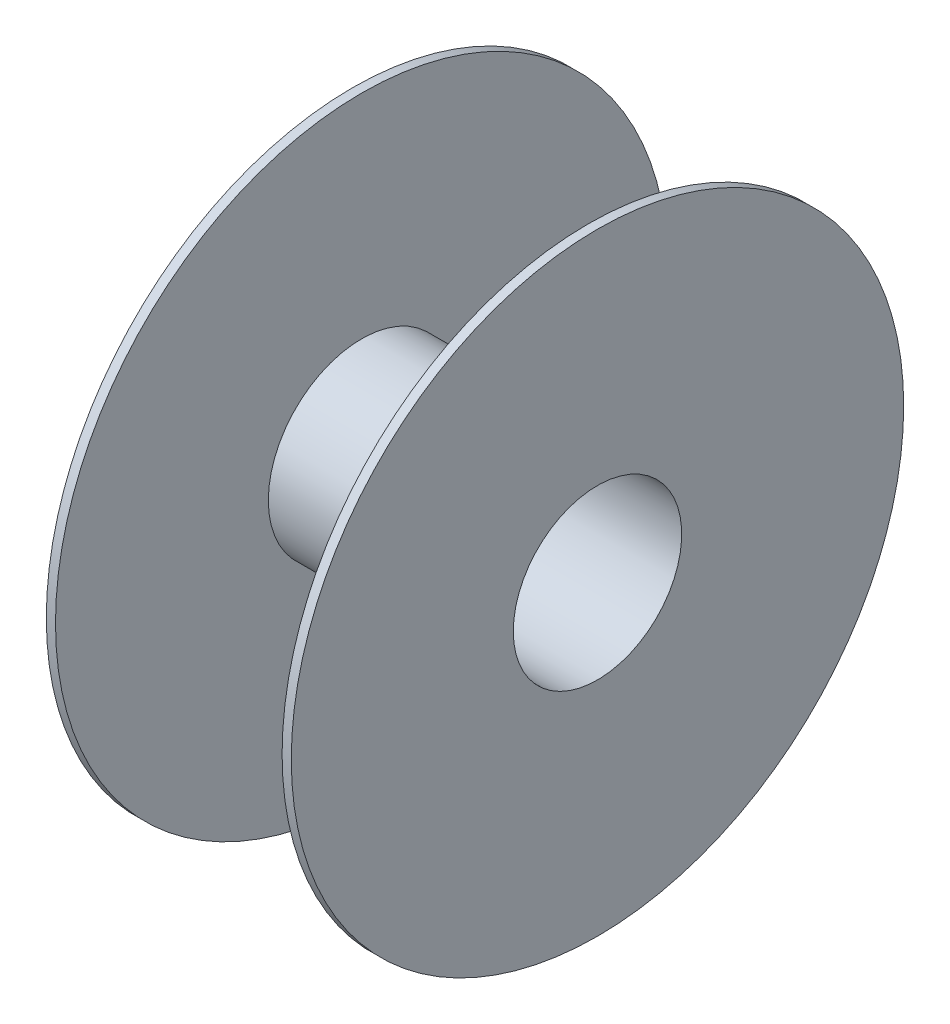
ISO-10303-21;
HEADER;
FILE_DESCRIPTION(('STEP AP214'),'2;1');
FILE_NAME('part.step','',(''),(''),'','','');
FILE_SCHEMA(('AUTOMOTIVE_DESIGN { 1 0 10303 214 1 1 1 1 }'));
ENDSEC;
DATA;
#1=APPLICATION_CONTEXT('core data for automotive mechanical design processes');
#2=APPLICATION_PROTOCOL_DEFINITION('international standard','automotive_design',2000,#1);
#3=PRODUCT_CONTEXT('',#1,'mechanical');
#4=PRODUCT('Part','Part','',(#3));
#5=PRODUCT_RELATED_PRODUCT_CATEGORY('part','',(#4));
#6=PRODUCT_DEFINITION_FORMATION('','',#4);
#7=PRODUCT_DEFINITION_CONTEXT('part definition',#1,'design');
#8=PRODUCT_DEFINITION('design','',#6,#7);
#9=PRODUCT_DEFINITION_SHAPE('','',#8);
#10=(LENGTH_UNIT() NAMED_UNIT(*) SI_UNIT(.MILLI.,.METRE.));
#11=(NAMED_UNIT(*) PLANE_ANGLE_UNIT() SI_UNIT($,.RADIAN.));
#12=(NAMED_UNIT(*) SI_UNIT($,.STERADIAN.) SOLID_ANGLE_UNIT());
#13=UNCERTAINTY_MEASURE_WITH_UNIT(LENGTH_MEASURE(1.E-05),#10,'distance_accuracy_value','');
#14=(GEOMETRIC_REPRESENTATION_CONTEXT(3) GLOBAL_UNCERTAINTY_ASSIGNED_CONTEXT((#13)) GLOBAL_UNIT_ASSIGNED_CONTEXT((#10,
#11,#12)) REPRESENTATION_CONTEXT('',''));
#15=CARTESIAN_POINT('',(0.,0.,0.));
#16=DIRECTION('',(0.,0.,1.));
#17=DIRECTION('',(1.,0.,0.));
#18=AXIS2_PLACEMENT_3D('',#15,#16,#17);
#19=CARTESIAN_POINT('',(-40.,0.,0.));
#20=DIRECTION('',(-1.,0.,0.));
#21=DIRECTION('',(0.,0.,1.));
#22=AXIS2_PLACEMENT_3D('',#19,#20,#21);
#23=CYLINDRICAL_SURFACE('',#22,100.);
#24=CARTESIAN_POINT('',(37.,0.,0.));
#25=DIRECTION('',(-1.,0.,0.));
#26=DIRECTION('',(0.,0.,1.));
#27=AXIS2_PLACEMENT_3D('',#24,#25,#26);
#28=CIRCLE('',#27,100.);
#29=CARTESIAN_POINT('',(37.,0.,100.));
#30=VERTEX_POINT('',#29);
#31=EDGE_CURVE('E63',#30,#30,#28,.T.);
#32=ORIENTED_EDGE('',*,*,#31,.F.);
#33=EDGE_LOOP('',(#32));
#34=FACE_BOUND('',#33,.T.);
#35=CARTESIAN_POINT('',(40.,0.,0.));
#36=DIRECTION('',(-1.,0.,0.));
#37=DIRECTION('',(0.,0.,1.));
#38=AXIS2_PLACEMENT_3D('',#35,#36,#37);
#39=CIRCLE('',#38,100.);
#40=CARTESIAN_POINT('',(40.,0.,100.));
#41=VERTEX_POINT('',#40);
#42=EDGE_CURVE('E10',#41,#41,#39,.T.);
#43=ORIENTED_EDGE('',*,*,#42,.T.);
#44=EDGE_LOOP('',(#43));
#45=FACE_BOUND('',#44,.T.);
#46=ADVANCED_FACE('F35',(#34,#45),#23,.T.);
#47=CARTESIAN_POINT('',(40.,100.,0.));
#48=DIRECTION('',(-1.,0.,0.));
#49=DIRECTION('',(0.,0.,1.));
#50=AXIS2_PLACEMENT_3D('',#47,#48,#49);
#51=PLANE('',#50);
#52=ORIENTED_EDGE('',*,*,#42,.F.);
#53=EDGE_LOOP('',(#52));
#54=FACE_BOUND('',#53,.T.);
#55=CARTESIAN_POINT('',(40.,0.,0.));
#56=DIRECTION('',(-1.,0.,0.));
#57=DIRECTION('',(0.,0.,1.));
#58=AXIS2_PLACEMENT_3D('',#55,#56,#57);
#59=CIRCLE('',#58,27.5);
#60=CARTESIAN_POINT('',(40.,0.,27.5));
#61=VERTEX_POINT('',#60);
#62=EDGE_CURVE('E41',#61,#61,#59,.T.);
#63=ORIENTED_EDGE('',*,*,#62,.T.);
#64=EDGE_LOOP('',(#63));
#65=FACE_BOUND('',#64,.T.);
#66=ADVANCED_FACE('F70',(#54,#65),#51,.F.);
#67=CARTESIAN_POINT('',(-40.,0.,0.));
#68=DIRECTION('',(-1.,0.,0.));
#69=DIRECTION('',(0.,0.,1.));
#70=AXIS2_PLACEMENT_3D('',#67,#68,#69);
#71=CYLINDRICAL_SURFACE('',#70,27.5);
#72=ORIENTED_EDGE('',*,*,#62,.F.);
#73=EDGE_LOOP('',(#72));
#74=FACE_BOUND('',#73,.T.);
#75=CARTESIAN_POINT('',(-40.,0.,0.));
#76=DIRECTION('',(-1.,0.,0.));
#77=DIRECTION('',(0.,0.,1.));
#78=AXIS2_PLACEMENT_3D('',#75,#76,#77);
#79=CIRCLE('',#78,27.5);
#80=CARTESIAN_POINT('',(-40.,0.,27.5));
#81=VERTEX_POINT('',#80);
#82=EDGE_CURVE('E45',#81,#81,#79,.T.);
#83=ORIENTED_EDGE('',*,*,#82,.T.);
#84=EDGE_LOOP('',(#83));
#85=FACE_BOUND('',#84,.T.);
#86=ADVANCED_FACE('F74',(#74,#85),#71,.F.);
#87=CARTESIAN_POINT('',(-40.,100.,0.));
#88=DIRECTION('',(1.,0.,0.));
#89=DIRECTION('',(0.,0.,-1.));
#90=AXIS2_PLACEMENT_3D('',#87,#88,#89);
#91=PLANE('',#90);
#92=ORIENTED_EDGE('',*,*,#82,.F.);
#93=EDGE_LOOP('',(#92));
#94=FACE_BOUND('',#93,.T.);
#95=CARTESIAN_POINT('',(-40.,0.,0.));
#96=DIRECTION('',(-1.,0.,0.));
#97=DIRECTION('',(0.,0.,1.));
#98=AXIS2_PLACEMENT_3D('',#95,#96,#97);
#99=CIRCLE('',#98,100.);
#100=CARTESIAN_POINT('',(-40.,0.,100.));
#101=VERTEX_POINT('',#100);
#102=EDGE_CURVE('E49',#101,#101,#99,.T.);
#103=ORIENTED_EDGE('',*,*,#102,.T.);
#104=EDGE_LOOP('',(#103));
#105=FACE_BOUND('',#104,.T.);
#106=ADVANCED_FACE('F79',(#94,#105),#91,.F.);
#107=CARTESIAN_POINT('',(-40.,0.,0.));
#108=DIRECTION('',(-1.,0.,0.));
#109=DIRECTION('',(0.,0.,1.));
#110=AXIS2_PLACEMENT_3D('',#107,#108,#109);
#111=CYLINDRICAL_SURFACE('',#110,100.);
#112=ORIENTED_EDGE('',*,*,#102,.F.);
#113=EDGE_LOOP('',(#112));
#114=FACE_BOUND('',#113,.T.);
#115=CARTESIAN_POINT('',(-37.,0.,0.));
#116=DIRECTION('',(-1.,0.,0.));
#117=DIRECTION('',(0.,0.,1.));
#118=AXIS2_PLACEMENT_3D('',#115,#116,#117);
#119=CIRCLE('',#118,100.);
#120=CARTESIAN_POINT('',(-37.,0.,100.));
#121=VERTEX_POINT('',#120);
#122=EDGE_CURVE('E54',#121,#121,#119,.T.);
#123=ORIENTED_EDGE('',*,*,#122,.T.);
#124=EDGE_LOOP('',(#123));
#125=FACE_BOUND('',#124,.T.);
#126=ADVANCED_FACE('F85',(#114,#125),#111,.T.);
#127=CARTESIAN_POINT('',(-37.,30.5,0.));
#128=DIRECTION('',(-1.,0.,0.));
#129=DIRECTION('',(0.,0.,1.));
#130=AXIS2_PLACEMENT_3D('',#127,#128,#129);
#131=PLANE('',#130);
#132=ORIENTED_EDGE('',*,*,#122,.F.);
#133=EDGE_LOOP('',(#132));
#134=FACE_BOUND('',#133,.T.);
#135=CARTESIAN_POINT('',(-37.,0.,0.));
#136=DIRECTION('',(-1.,0.,0.));
#137=DIRECTION('',(0.,0.,1.));
#138=AXIS2_PLACEMENT_3D('',#135,#136,#137);
#139=CIRCLE('',#138,30.5);
#140=CARTESIAN_POINT('',(-37.,0.,30.5));
#141=VERTEX_POINT('',#140);
#142=EDGE_CURVE('E57',#141,#141,#139,.T.);
#143=ORIENTED_EDGE('',*,*,#142,.T.);
#144=EDGE_LOOP('',(#143));
#145=FACE_BOUND('',#144,.T.);
#146=ADVANCED_FACE('F89',(#134,#145),#131,.F.);
#147=CARTESIAN_POINT('',(-40.,0.,0.));
#148=DIRECTION('',(-1.,0.,0.));
#149=DIRECTION('',(0.,0.,1.));
#150=AXIS2_PLACEMENT_3D('',#147,#148,#149);
#151=CYLINDRICAL_SURFACE('',#150,30.5);
#152=ORIENTED_EDGE('',*,*,#142,.F.);
#153=EDGE_LOOP('',(#152));
#154=FACE_BOUND('',#153,.T.);
#155=CARTESIAN_POINT('',(37.,0.,0.));
#156=DIRECTION('',(-1.,0.,0.));
#157=DIRECTION('',(0.,0.,1.));
#158=AXIS2_PLACEMENT_3D('',#155,#156,#157);
#159=CIRCLE('',#158,30.5);
#160=CARTESIAN_POINT('',(37.,0.,30.5));
#161=VERTEX_POINT('',#160);
#162=EDGE_CURVE('E60',#161,#161,#159,.T.);
#163=ORIENTED_EDGE('',*,*,#162,.T.);
#164=EDGE_LOOP('',(#163));
#165=FACE_BOUND('',#164,.T.);
#166=ADVANCED_FACE('F93',(#154,#165),#151,.T.);
#167=CARTESIAN_POINT('',(37.,30.5,0.));
#168=DIRECTION('',(1.,0.,0.));
#169=DIRECTION('',(0.,0.,-1.));
#170=AXIS2_PLACEMENT_3D('',#167,#168,#169);
#171=PLANE('',#170);
#172=ORIENTED_EDGE('',*,*,#162,.F.);
#173=EDGE_LOOP('',(#172));
#174=FACE_BOUND('',#173,.T.);
#175=ORIENTED_EDGE('',*,*,#31,.T.);
#176=EDGE_LOOP('',(#175));
#177=FACE_BOUND('',#176,.T.);
#178=ADVANCED_FACE('F67',(#174,#177),#171,.F.);
#179=CLOSED_SHELL('',(#46,#66,#86,#106,#126,#146,#166,#178));
#180=MANIFOLD_SOLID_BREP('B2',#179);
#181=ADVANCED_BREP_SHAPE_REPRESENTATION('',(#18,#180),#14);
#182=SHAPE_DEFINITION_REPRESENTATION(#9,#181);
ENDSEC;
END-ISO-10303-21;
